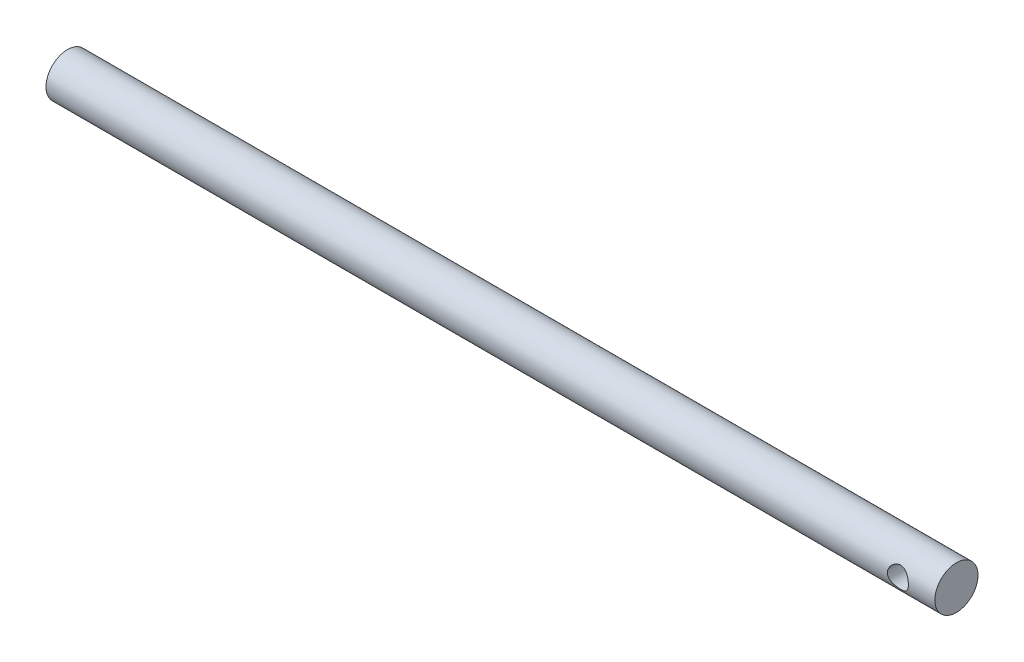
ISO-10303-21;
HEADER;
FILE_DESCRIPTION(('STEP AP214'),'2;1');
FILE_NAME('part.step','',(''),(''),'','','');
FILE_SCHEMA(('AUTOMOTIVE_DESIGN { 1 0 10303 214 1 1 1 1 }'));
ENDSEC;
DATA;
#1=APPLICATION_CONTEXT('core data for automotive mechanical design processes');
#2=APPLICATION_PROTOCOL_DEFINITION('international standard','automotive_design',2000,#1);
#3=PRODUCT_CONTEXT('',#1,'mechanical');
#4=PRODUCT('Part','Part','',(#3));
#5=PRODUCT_RELATED_PRODUCT_CATEGORY('part','',(#4));
#6=PRODUCT_DEFINITION_FORMATION('','',#4);
#7=PRODUCT_DEFINITION_CONTEXT('part definition',#1,'design');
#8=PRODUCT_DEFINITION('design','',#6,#7);
#9=PRODUCT_DEFINITION_SHAPE('','',#8);
#10=(LENGTH_UNIT() NAMED_UNIT(*) SI_UNIT(.MILLI.,.METRE.));
#11=(NAMED_UNIT(*) PLANE_ANGLE_UNIT() SI_UNIT($,.RADIAN.));
#12=(NAMED_UNIT(*) SI_UNIT($,.STERADIAN.) SOLID_ANGLE_UNIT());
#13=UNCERTAINTY_MEASURE_WITH_UNIT(LENGTH_MEASURE(1.E-05),#10,'distance_accuracy_value','');
#14=(GEOMETRIC_REPRESENTATION_CONTEXT(3) GLOBAL_UNCERTAINTY_ASSIGNED_CONTEXT((#13)) GLOBAL_UNIT_ASSIGNED_CONTEXT((#10,
#11,#12)) REPRESENTATION_CONTEXT('',''));
#15=CARTESIAN_POINT('',(0.,0.,0.));
#16=DIRECTION('',(0.,0.,1.));
#17=DIRECTION('',(1.,0.,0.));
#18=AXIS2_PLACEMENT_3D('',#15,#16,#17);
#19=CARTESIAN_POINT('',(70.7,80.6,0.));
#20=DIRECTION('',(1.,0.,0.));
#21=DIRECTION('',(0.,0.,1.));
#22=AXIS2_PLACEMENT_3D('',#19,#20,#21);
#23=PLANE('',#22);
#24=CARTESIAN_POINT('',(70.7,80.6,0.));
#25=DIRECTION('',(1.,0.,0.));
#26=DIRECTION('',(0.,0.,-1.));
#27=AXIS2_PLACEMENT_3D('',#24,#25,#26);
#28=CIRCLE('',#27,3.5);
#29=CARTESIAN_POINT('',(70.7,80.6,-3.5));
#30=VERTEX_POINT('',#29);
#31=EDGE_CURVE('E17',#30,#30,#28,.T.);
#32=ORIENTED_EDGE('',*,*,#31,.T.);
#33=EDGE_LOOP('',(#32));
#34=FACE_BOUND('',#33,.T.);
#35=ADVANCED_FACE('F14',(#34),#23,.T.);
#36=CARTESIAN_POINT('',(-73.5,80.6,0.));
#37=DIRECTION('',(1.,0.,0.));
#38=DIRECTION('',(0.,0.,1.));
#39=AXIS2_PLACEMENT_3D('',#36,#37,#38);
#40=PLANE('',#39);
#41=CARTESIAN_POINT('',(-73.5,80.6,0.));
#42=DIRECTION('',(1.,0.,0.));
#43=DIRECTION('',(0.,0.,-1.));
#44=AXIS2_PLACEMENT_3D('',#41,#42,#43);
#45=CIRCLE('',#44,3.5);
#46=CARTESIAN_POINT('',(-73.5,80.6,-3.5));
#47=VERTEX_POINT('',#46);
#48=EDGE_CURVE('E46',#47,#47,#45,.T.);
#49=ORIENTED_EDGE('',*,*,#48,.F.);
#50=EDGE_LOOP('',(#49));
#51=FACE_BOUND('',#50,.T.);
#52=ADVANCED_FACE('F108',(#51),#40,.F.);
#53=CARTESIAN_POINT('',(64.7,80.6,-4.));
#54=DIRECTION('',(0.,0.,1.));
#55=DIRECTION('',(1.,0.,0.));
#56=AXIS2_PLACEMENT_3D('',#53,#54,#55);
#57=CYLINDRICAL_SURFACE('',#56,1.7);
#58=DIRECTION('',(0.,0.,1.));
#59=VECTOR('',#58,1.);
#60=CARTESIAN_POINT('',(66.4,80.6,-4.));
#61=LINE('',#60,#59);
#62=CARTESIAN_POINT('',(66.4,80.6,-3.5));
#63=VERTEX_POINT('',#62);
#64=CARTESIAN_POINT('',(66.4,80.6,3.5));
#65=VERTEX_POINT('',#64);
#66=EDGE_CURVE('E9',#63,#65,#61,.T.);
#67=ORIENTED_EDGE('',*,*,#66,.F.);
#68=CARTESIAN_POINT('',(63.,80.6,-3.5));
#69=CARTESIAN_POINT('',(63.,80.467626961764,-3.5));
#70=CARTESIAN_POINT('',(63.012368936181,80.336082629433,-3.493992150921));
#71=CARTESIAN_POINT('',(63.036816250894,80.207410902409,-3.48211813001));
#72=CARTESIAN_POINT('',(63.072456959114,80.083599465136,-3.465056418101));
#73=CARTESIAN_POINT('',(63.117818095487,79.966454062094,-3.443988785715));
#74=CARTESIAN_POINT('',(63.194463223348,79.808603148655,-3.409720031189));
#75=CARTESIAN_POINT('',(63.219785481802,79.761219130431,-3.398555947052));
#76=CARTESIAN_POINT('',(63.246593857292,79.715335355493,-3.38692802402));
#77=CARTESIAN_POINT('',(63.274780549337,79.670972012776,-3.374927018793));
#78=CARTESIAN_POINT('',(63.304242631629,79.62814378284,-3.362641183717));
#79=CARTESIAN_POINT('',(63.372363089202,79.536357411385,-3.334883535461));
#80=CARTESIAN_POINT('',(63.411612428005,79.488157097466,-3.319309884091));
#81=CARTESIAN_POINT('',(63.452475038941,79.442246179138,-3.303581444565));
#82=CARTESIAN_POINT('',(63.494813540026,79.39860849316,-3.287835082887));
#83=CARTESIAN_POINT('',(63.538507672395,79.357225574193,-3.272198300415));
#84=CARTESIAN_POINT('',(63.636504589978,79.271870871535,-3.238601379104));
#85=CARTESIAN_POINT('',(63.691307533732,79.228770899575,-3.220728014406));
#86=CARTESIAN_POINT('',(63.747688318605,79.188752605912,-3.20336523669));
#87=CARTESIAN_POINT('',(63.805494278617,79.151794155935,-3.186694401143));
#88=CARTESIAN_POINT('',(63.864593317099,79.117878890136,-3.170881561662));
#89=CARTESIAN_POINT('',(63.982223412966,79.057615768401,-3.141991810153));
#90=CARTESIAN_POINT('',(64.040644926005,79.030979130598,-3.128818705613));
#91=CARTESIAN_POINT('',(64.100009380795,79.007095638706,-3.116695122328));
#92=CARTESIAN_POINT('',(64.160197185626,78.985972128808,-3.105743193823));
#93=CARTESIAN_POINT('',(64.221096760984,78.967615995983,-3.096067551833));
#94=CARTESIAN_POINT('',(64.350926799425,78.934732651396,-3.078517404664));
#95=CARTESIAN_POINT('',(64.419996089501,78.920855942297,-3.070961637835));
#96=CARTESIAN_POINT('',(64.489621521996,78.910432807268,-3.065209030803));
#97=CARTESIAN_POINT('',(64.559617395511,78.903478367105,-3.06134439336));
#98=CARTESIAN_POINT('',(64.629802528403,78.9,-3.059411708156));
#99=CARTESIAN_POINT('',(64.834561723354,78.9,-3.059411708156));
#100=CARTESIAN_POINT('',(64.968882545134,78.91278106465,-3.066513627042));
#101=CARTESIAN_POINT('',(65.101872224254,78.938259036702,-3.08067095027));
#102=CARTESIAN_POINT('',(65.232408619513,78.976373284679,-3.1013251367));
#103=CARTESIAN_POINT('',(65.359254226747,79.027050046866,-3.127411166813));
#104=CARTESIAN_POINT('',(65.542394180921,79.121774902055,-3.172710114264));
#105=CARTESIAN_POINT('',(65.602549456624,79.1566853597,-3.188934042963));
#106=CARTESIAN_POINT('',(65.661347794167,79.194763323085,-3.206036457297));
#107=CARTESIAN_POINT('',(65.71864827833,79.236027307423,-3.223840180764));
#108=CARTESIAN_POINT('',(65.774287287225,79.280501378077,-3.24215146178));
#109=CARTESIAN_POINT('',(65.872320231077,79.367456788735,-3.276066477418));
#110=CARTESIAN_POINT('',(65.915318135335,79.408896030022,-3.29157595415));
#111=CARTESIAN_POINT('',(65.956968060694,79.452549882023,-3.307172995556));
#112=CARTESIAN_POINT('',(65.997150986469,79.498435837086,-3.322732575525));
#113=CARTESIAN_POINT('',(66.035731332892,79.546568850322,-3.338120626365));
#114=CARTESIAN_POINT('',(66.102217709225,79.637548597836,-3.365335365513));
#115=CARTESIAN_POINT('',(66.130744053659,79.67960743773,-3.377274305976));
#116=CARTESIAN_POINT('',(66.158043023449,79.723126927967,-3.388930648383));
#117=CARTESIAN_POINT('',(66.184017943673,79.7680921572,-3.400221892537));
#118=CARTESIAN_POINT('',(66.208567928865,79.81448312499,-3.411063392848));
#119=CARTESIAN_POINT('',(66.283835178391,79.970745102033,-3.44475704851));
#120=CARTESIAN_POINT('',(66.328581336634,80.087221142821,-3.465553459099));
#121=CARTESIAN_POINT('',(66.363719503812,80.210236002231,-3.482378337048));
#122=CARTESIAN_POINT('',(66.387812989989,80.338014166915,-3.494080519134));
#123=CARTESIAN_POINT('',(66.4,80.468604065674,-3.5));
#124=CARTESIAN_POINT('',(66.4,80.6,-3.5));
#125=(BOUNDED_CURVE() B_SPLINE_CURVE(6,(#68,#69,#70,#71,#72,#73,#74,#75,#76,#77,#78,#79,#80,#81,
#82,#83,#84,#85,#86,#87,#88,#89,#90,#91,#92,#93,#94,#95,#96,#97,#98,#99,#100,#101,#102,#103,
#104,#105,#106,#107,#108,#109,#110,#111,#112,#113,#114,#115,#116,#117,#118,#119,#120,#121,#122,
#123,#124),.UNSPECIFIED.,.F.,.F.) B_SPLINE_CURVE_WITH_KNOTS((7,5,5,5,5,5,5,5,5,5,5,7),(0.,
0.126705234741,0.18350404575,0.252985723906,0.334996383348,0.413022152866,0.499693533218,
0.665834136864,0.749613049,0.818522163996,0.874025872331,1.),
.UNSPECIFIED.) CURVE() GEOMETRIC_REPRESENTATION_ITEM() RATIONAL_B_SPLINE_CURVE((1.,1.,1.,1.,1.,
1.,1.,1.,1.,1.,1.,1.,1.,1.,1.,1.,1.,1.,1.,1.,1.,1.,1.,1.,1.,1.,1.,1.,1.,1.,1.,1.,1.,1.,1.,1.,1.,
1.,1.,1.,1.,1.,1.,1.,1.,1.,1.,1.,1.,1.,1.,1.,1.,1.,1.,1.,1.)) REPRESENTATION_ITEM(''));
#126=CARTESIAN_POINT('',(63.,80.6,-3.5));
#127=VERTEX_POINT('',#126);
#128=EDGE_CURVE('E76',#127,#63,#125,.T.);
#129=ORIENTED_EDGE('',*,*,#128,.F.);
#130=CARTESIAN_POINT('',(66.4,80.6,-3.5));
#131=CARTESIAN_POINT('',(66.4,80.732373038236,-3.5));
#132=CARTESIAN_POINT('',(66.387631063819,80.863917370567,-3.493992150921));
#133=CARTESIAN_POINT('',(66.363183749106,80.992589097591,-3.48211813001));
#134=CARTESIAN_POINT('',(66.327543040886,81.116400534864,-3.465056418101));
#135=CARTESIAN_POINT('',(66.282181904513,81.233545937906,-3.443988785715));
#136=CARTESIAN_POINT('',(66.205536776652,81.391396851345,-3.409720031189));
#137=CARTESIAN_POINT('',(66.180214518198,81.438780869569,-3.398555947052));
#138=CARTESIAN_POINT('',(66.153406142708,81.484664644507,-3.38692802402));
#139=CARTESIAN_POINT('',(66.125219450663,81.529027987224,-3.374927018793));
#140=CARTESIAN_POINT('',(66.095757368371,81.57185621716,-3.362641183717));
#141=CARTESIAN_POINT('',(66.027636910798,81.663642588615,-3.334883535461));
#142=CARTESIAN_POINT('',(65.988387571995,81.711842902534,-3.319309884091));
#143=CARTESIAN_POINT('',(65.947524961059,81.757753820862,-3.303581444565));
#144=CARTESIAN_POINT('',(65.905186459974,81.80139150684,-3.287835082887));
#145=CARTESIAN_POINT('',(65.861492327605,81.842774425807,-3.272198300415));
#146=CARTESIAN_POINT('',(65.763495410022,81.928129128465,-3.238601379104));
#147=CARTESIAN_POINT('',(65.708692466268,81.971229100425,-3.220728014406));
#148=CARTESIAN_POINT('',(65.652311681395,82.011247394088,-3.20336523669));
#149=CARTESIAN_POINT('',(65.594505721383,82.048205844065,-3.186694401143));
#150=CARTESIAN_POINT('',(65.535406682901,82.082121109864,-3.170881561662));
#151=CARTESIAN_POINT('',(65.417776587034,82.142384231599,-3.141991810153));
#152=CARTESIAN_POINT('',(65.359355073996,82.169020869402,-3.128818705613));
#153=CARTESIAN_POINT('',(65.299990619205,82.192904361294,-3.116695122328));
#154=CARTESIAN_POINT('',(65.239802814374,82.214027871192,-3.105743193823));
#155=CARTESIAN_POINT('',(65.178903239016,82.232384004017,-3.096067551833));
#156=CARTESIAN_POINT('',(65.049073200575,82.265267348604,-3.078517404664));
#157=CARTESIAN_POINT('',(64.980003910499,82.279144057703,-3.070961637835));
#158=CARTESIAN_POINT('',(64.910378478004,82.289567192732,-3.065209030803));
#159=CARTESIAN_POINT('',(64.840382604489,82.296521632895,-3.06134439336));
#160=CARTESIAN_POINT('',(64.770197471597,82.3,-3.059411708156));
#161=CARTESIAN_POINT('',(64.565438276646,82.3,-3.059411708156));
#162=CARTESIAN_POINT('',(64.431117454866,82.28721893535,-3.066513627042));
#163=CARTESIAN_POINT('',(64.298127775745,82.261740963298,-3.08067095027));
#164=CARTESIAN_POINT('',(64.167591380487,82.223626715321,-3.1013251367));
#165=CARTESIAN_POINT('',(64.040745773253,82.172949953134,-3.127411166813));
#166=CARTESIAN_POINT('',(63.857605819079,82.078225097945,-3.172710114264));
#167=CARTESIAN_POINT('',(63.797450543376,82.0433146403,-3.188934042963));
#168=CARTESIAN_POINT('',(63.738652205833,82.005236676915,-3.206036457297));
#169=CARTESIAN_POINT('',(63.68135172167,81.963972692577,-3.223840180764));
#170=CARTESIAN_POINT('',(63.625712712775,81.919498621923,-3.24215146178));
#171=CARTESIAN_POINT('',(63.527679768923,81.832543211265,-3.276066477418));
#172=CARTESIAN_POINT('',(63.484681864665,81.791103969978,-3.29157595415));
#173=CARTESIAN_POINT('',(63.443031939305,81.747450117977,-3.307172995556));
#174=CARTESIAN_POINT('',(63.402849013531,81.701564162914,-3.322732575525));
#175=CARTESIAN_POINT('',(63.364268667108,81.653431149678,-3.338120626365));
#176=CARTESIAN_POINT('',(63.297782284494,81.562451393568,-3.365335368085));
#177=CARTESIAN_POINT('',(63.269255947502,81.520392565785,-3.377274305394));
#178=CARTESIAN_POINT('',(63.241956982364,81.47687308176,-3.388930645903));
#179=CARTESIAN_POINT('',(63.215982058298,81.431907844441,-3.400221891784));
#180=CARTESIAN_POINT('',(63.191432065867,81.385516864073,-3.411063395206));
#181=CARTESIAN_POINT('',(63.116164821609,81.229254897967,-3.44475704851));
#182=CARTESIAN_POINT('',(63.071418663367,81.112778857179,-3.465553459099));
#183=CARTESIAN_POINT('',(63.036280496188,80.989763997769,-3.482378337048));
#184=CARTESIAN_POINT('',(63.012187010011,80.861985833085,-3.494080519134));
#185=CARTESIAN_POINT('',(63.,80.731395934326,-3.5));
#186=CARTESIAN_POINT('',(63.,80.6,-3.5));
#187=(BOUNDED_CURVE() B_SPLINE_CURVE(6,(#130,#131,#132,#133,#134,#135,#136,#137,#138,#139,#140,
#141,#142,#143,#144,#145,#146,#147,#148,#149,#150,#151,#152,#153,#154,#155,#156,#157,#158,#159,
#160,#161,#162,#163,#164,#165,#166,#167,#168,#169,#170,#171,#172,#173,#174,#175,#176,#177,#178,
#179,#180,#181,#182,#183,#184,#185,#186),.UNSPECIFIED.,.F.,.F.) B_SPLINE_CURVE_WITH_KNOTS((7,5,
5,5,5,5,5,5,5,5,5,7),(0.,0.126705226218,0.183504033407,0.25298570689,0.334996360815,
0.413022125086,0.499693499608,0.66583409208,0.749612998581,0.818522108943,0.874025825298,1.),
.UNSPECIFIED.) CURVE() GEOMETRIC_REPRESENTATION_ITEM() RATIONAL_B_SPLINE_CURVE((1.,1.,1.,1.,1.,
1.,1.,1.,1.,1.,1.,1.,1.,1.,1.,1.,1.,1.,1.,1.,1.,1.,1.,1.,1.,1.,1.,1.,1.,1.,1.,1.,1.,1.,1.,1.,1.,
1.,1.,1.,1.,1.,1.,1.,1.,1.,1.,1.,1.,1.,1.,1.,1.,1.,1.,1.,1.)) REPRESENTATION_ITEM(''));
#188=EDGE_CURVE('E60',#63,#127,#187,.T.);
#189=ORIENTED_EDGE('',*,*,#188,.F.);
#190=ORIENTED_EDGE('',*,*,#66,.T.);
#191=CARTESIAN_POINT('',(66.4,80.6,3.5));
#192=CARTESIAN_POINT('',(66.4,80.732373038236,3.5));
#193=CARTESIAN_POINT('',(66.387631063819,80.863917370568,3.493992150921));
#194=CARTESIAN_POINT('',(66.363183749106,80.992589097591,3.48211813001));
#195=CARTESIAN_POINT('',(66.327543040886,81.116400534864,3.465056418101));
#196=CARTESIAN_POINT('',(66.282181904513,81.233545937906,3.443988785715));
#197=CARTESIAN_POINT('',(66.205536776652,81.391396851345,3.409720031189));
#198=CARTESIAN_POINT('',(66.180214518198,81.438780869569,3.398555947052));
#199=CARTESIAN_POINT('',(66.153406142708,81.484664644507,3.38692802402));
#200=CARTESIAN_POINT('',(66.125219450663,81.529027987224,3.374927018793));
#201=CARTESIAN_POINT('',(66.095757368371,81.57185621716,3.362641183717));
#202=CARTESIAN_POINT('',(66.027636910798,81.663642588615,3.334883535461));
#203=CARTESIAN_POINT('',(65.988387571995,81.711842902534,3.319309884091));
#204=CARTESIAN_POINT('',(65.947524961059,81.757753820862,3.303581444565));
#205=CARTESIAN_POINT('',(65.905186459974,81.80139150684,3.287835082887));
#206=CARTESIAN_POINT('',(65.861492327605,81.842774425807,3.272198300415));
#207=CARTESIAN_POINT('',(65.763495410022,81.928129128465,3.238601379104));
#208=CARTESIAN_POINT('',(65.708692466268,81.971229100425,3.220728014406));
#209=CARTESIAN_POINT('',(65.652311681395,82.011247394088,3.20336523669));
#210=CARTESIAN_POINT('',(65.594505721383,82.048205844065,3.186694401143));
#211=CARTESIAN_POINT('',(65.535406682901,82.082121109864,3.170881561662));
#212=CARTESIAN_POINT('',(65.417776587034,82.142384231599,3.141991810153));
#213=CARTESIAN_POINT('',(65.359355073995,82.169020869402,3.128818705613));
#214=CARTESIAN_POINT('',(65.299990619205,82.192904361294,3.116695122329));
#215=CARTESIAN_POINT('',(65.239802814374,82.214027871192,3.105743193824));
#216=CARTESIAN_POINT('',(65.178903239016,82.232384004017,3.096067551833));
#217=CARTESIAN_POINT('',(65.049073200575,82.265267348604,3.078517404664));
#218=CARTESIAN_POINT('',(64.980003910499,82.279144057703,3.070961637835));
#219=CARTESIAN_POINT('',(64.910378478004,82.289567192732,3.065209030803));
#220=CARTESIAN_POINT('',(64.840382604489,82.296521632895,3.06134439336));
#221=CARTESIAN_POINT('',(64.770197471597,82.3,3.059411708156));
#222=CARTESIAN_POINT('',(64.565438276646,82.3,3.059411708156));
#223=CARTESIAN_POINT('',(64.431117454866,82.28721893535,3.066513627042));
#224=CARTESIAN_POINT('',(64.298127775746,82.261740963298,3.08067095027));
#225=CARTESIAN_POINT('',(64.167591380487,82.223626715321,3.1013251367));
#226=CARTESIAN_POINT('',(64.040745773253,82.172949953134,3.127411166813));
#227=CARTESIAN_POINT('',(63.857605819079,82.078225097945,3.172710114264));
#228=CARTESIAN_POINT('',(63.797450543376,82.0433146403,3.188934042963));
#229=CARTESIAN_POINT('',(63.738652205833,82.005236676915,3.206036457297));
#230=CARTESIAN_POINT('',(63.68135172167,81.963972692577,3.223840180764));
#231=CARTESIAN_POINT('',(63.625712712775,81.919498621923,3.24215146178));
#232=CARTESIAN_POINT('',(63.527679765886,81.832543208571,3.276066478469));
#233=CARTESIAN_POINT('',(63.484681865759,81.791103970458,3.291575953834));
#234=CARTESIAN_POINT('',(63.443031942155,81.747450121134,3.307172994485));
#235=CARTESIAN_POINT('',(63.402849013957,81.70156416411,3.322732575269));
#236=CARTESIAN_POINT('',(63.364268664446,81.653431146037,3.338120627454));
#237=CARTESIAN_POINT('',(63.297782284494,81.562451393568,3.365335368085));
#238=CARTESIAN_POINT('',(63.269255947502,81.520392565785,3.377274305394));
#239=CARTESIAN_POINT('',(63.241956982364,81.47687308176,3.388930645903));
#240=CARTESIAN_POINT('',(63.215982058298,81.431907844441,3.400221891784));
#241=CARTESIAN_POINT('',(63.191432065867,81.385516864073,3.411063395206));
#242=CARTESIAN_POINT('',(63.138164233229,81.274927771296,3.434908932569));
#243=CARTESIAN_POINT('',(63.110528040144,81.209649356495,3.447537049086));
#244=CARTESIAN_POINT('',(63.085825612466,81.142091046458,3.459020484849));
#245=CARTESIAN_POINT('',(63.064339203336,81.072479370317,3.469143717989));
#246=CARTESIAN_POINT('',(63.0463147191,81.00106404391,3.477717107832));
#247=CARTESIAN_POINT('',(63.010433319595,80.818654514117,3.494893157432));
#248=CARTESIAN_POINT('',(62.997191296132,80.705820566747,3.501355052023));
#249=CARTESIAN_POINT('',(62.993084534697,80.591296032958,3.50338771628));
#250=CARTESIAN_POINT('',(62.998366939204,80.476860549106,3.500778524825));
#251=CARTESIAN_POINT('',(63.0127423091,80.364291044026,3.493772340176));
#252=CARTESIAN_POINT('',(63.049989099161,80.184433097865,3.475970364206));
#253=CARTESIAN_POINT('',(63.068116295068,80.115111937202,3.467363789869));
#254=CARTESIAN_POINT('',(63.089500765281,80.047541041852,3.457308465121));
#255=CARTESIAN_POINT('',(63.11391249979,79.981944255144,3.44598184347));
#256=CARTESIAN_POINT('',(63.141090500133,79.918524461951,3.433583475628));
#257=CARTESIAN_POINT('',(63.194463228818,79.808603137388,3.409720028743));
#258=CARTESIAN_POINT('',(63.219785479769,79.761219132061,3.398555947821));
#259=CARTESIAN_POINT('',(63.246593851267,79.715335365452,3.386928026582));
#260=CARTESIAN_POINT('',(63.274780548124,79.670972016417,3.374927019402));
#261=CARTESIAN_POINT('',(63.304242638125,79.628143774088,3.36264118107));
#262=CARTESIAN_POINT('',(63.372363089202,79.536357411385,3.334883535461));
#263=CARTESIAN_POINT('',(63.411612428005,79.488157097466,3.319309884091));
#264=CARTESIAN_POINT('',(63.452475038941,79.442246179138,3.303581444565));
#265=CARTESIAN_POINT('',(63.494813540026,79.39860849316,3.287835082887));
#266=CARTESIAN_POINT('',(63.538507672395,79.357225574193,3.272198300415));
#267=CARTESIAN_POINT('',(63.636504589978,79.271870871535,3.238601379104));
#268=CARTESIAN_POINT('',(63.691307533732,79.228770899575,3.220728014406));
#269=CARTESIAN_POINT('',(63.747688318605,79.188752605912,3.20336523669));
#270=CARTESIAN_POINT('',(63.805494278617,79.151794155935,3.186694401143));
#271=CARTESIAN_POINT('',(63.864593317099,79.117878890136,3.170881561662));
#272=CARTESIAN_POINT('',(63.982223412966,79.057615768401,3.141991810153));
#273=CARTESIAN_POINT('',(64.040644926004,79.030979130598,3.128818705613));
#274=CARTESIAN_POINT('',(64.100009380795,79.007095638706,3.116695122328));
#275=CARTESIAN_POINT('',(64.160197185626,78.985972128808,3.105743193823));
#276=CARTESIAN_POINT('',(64.221096760984,78.967615995983,3.096067551833));
#277=CARTESIAN_POINT('',(64.350926799425,78.934732651396,3.078517404664));
#278=CARTESIAN_POINT('',(64.419996089501,78.920855942297,3.070961637835));
#279=CARTESIAN_POINT('',(64.489621521996,78.910432807268,3.065209030803));
#280=CARTESIAN_POINT('',(64.559617395511,78.903478367105,3.06134439336));
#281=CARTESIAN_POINT('',(64.629802528403,78.9,3.059411708156));
#282=CARTESIAN_POINT('',(64.834561723354,78.9,3.059411708156));
#283=CARTESIAN_POINT('',(64.968882545134,78.91278106465,3.066513627042));
#284=CARTESIAN_POINT('',(65.101872224254,78.938259036702,3.08067095027));
#285=CARTESIAN_POINT('',(65.232408619513,78.976373284679,3.1013251367));
#286=CARTESIAN_POINT('',(65.359254226747,79.027050046866,3.127411166813));
#287=CARTESIAN_POINT('',(65.542394180921,79.121774902055,3.172710114264));
#288=CARTESIAN_POINT('',(65.602549456624,79.1566853597,3.188934042963));
#289=CARTESIAN_POINT('',(65.661347794167,79.194763323085,3.206036457297));
#290=CARTESIAN_POINT('',(65.71864827833,79.236027307423,3.223840180764));
#291=CARTESIAN_POINT('',(65.774287287225,79.280501378077,3.24215146178));
#292=CARTESIAN_POINT('',(65.872320231077,79.367456788735,3.276066477418));
#293=CARTESIAN_POINT('',(65.915318135335,79.408896030022,3.29157595415));
#294=CARTESIAN_POINT('',(65.956968060695,79.452549882023,3.307172995556));
#295=CARTESIAN_POINT('',(65.997150986469,79.498435837086,3.322732575525));
#296=CARTESIAN_POINT('',(66.035731332892,79.546568850322,3.338120626365));
#297=CARTESIAN_POINT('',(66.102217715506,79.637548606432,3.365335368085));
#298=CARTESIAN_POINT('',(66.130744052498,79.679607434215,3.377274305394));
#299=CARTESIAN_POINT('',(66.158043017636,79.72312691824,3.388930645903));
#300=CARTESIAN_POINT('',(66.184017941702,79.768092155558,3.400221891784));
#301=CARTESIAN_POINT('',(66.208567934133,79.814483135927,3.411063395206));
#302=CARTESIAN_POINT('',(66.283835178391,79.970745102033,3.44475704851));
#303=CARTESIAN_POINT('',(66.328581336634,80.087221142821,3.465553459099));
#304=CARTESIAN_POINT('',(66.363719503812,80.210236002231,3.482378337048));
#305=CARTESIAN_POINT('',(66.387812989989,80.338014166915,3.494080519134));
#306=CARTESIAN_POINT('',(66.4,80.468604065674,3.5));
#307=CARTESIAN_POINT('',(66.4,80.6,3.5));
#308=(BOUNDED_CURVE() B_SPLINE_CURVE(6,(#191,#192,#193,#194,#195,#196,#197,#198,#199,#200,#201,
#202,#203,#204,#205,#206,#207,#208,#209,#210,#211,#212,#213,#214,#215,#216,#217,#218,#219,#220,
#221,#222,#223,#224,#225,#226,#227,#228,#229,#230,#231,#232,#233,#234,#235,#236,#237,#238,#239,
#240,#241,#242,#243,#244,#245,#246,#247,#248,#249,#250,#251,#252,#253,#254,#255,#256,#257,#258,
#259,#260,#261,#262,#263,#264,#265,#266,#267,#268,#269,#270,#271,#272,#273,#274,#275,#276,#277,
#278,#279,#280,#281,#282,#283,#284,#285,#286,#287,#288,#289,#290,#291,#292,#293,#294,#295,#296,
#297,#298,#299,#300,#301,#302,#303,#304,#305,#306,#307),.UNSPECIFIED.,.T.,
.F.) B_SPLINE_CURVE_WITH_KNOTS((7,5,5,5,5,5,5,5,5,5,5,5,5,5,5,5,5,5,5,5,5,5,5,7),(0.,
0.06328678637236,0.09165668147463,0.126361420638,0.167324140883,0.206296486557,0.249587145733,
0.33257112751,0.374417055389,0.408835812815,0.436558839242,0.472986499648,0.527647250673,
0.56315636443,0.591568526343,0.626324977635,0.667348734774,0.706379151565,0.749734316401,
0.832841949254,0.874750230058,0.909220271118,0.936984602593,1.),
.UNSPECIFIED.) CURVE() GEOMETRIC_REPRESENTATION_ITEM() RATIONAL_B_SPLINE_CURVE((1.,1.,1.,1.,1.,
1.,1.,1.,1.,1.,1.,1.,1.,1.,1.,1.,1.,1.,1.,1.,1.,1.,1.,1.,1.,1.,1.,1.,1.,1.,1.,1.,1.,1.,1.,1.,1.,
1.,1.,1.,1.,1.,1.,1.,1.,1.,1.,1.,1.,1.,1.,1.,1.,1.,1.,1.,1.,1.,1.,1.,1.,1.,1.,1.,1.,1.,1.,1.,1.,
1.,1.,1.,1.,1.,1.,1.,1.,1.,1.,1.,1.,1.,1.,1.,1.,1.,1.,1.,1.,1.,1.,1.,1.,1.,1.,1.,1.,1.,1.,1.,1.,
1.,1.,1.,1.,1.,1.,1.,1.,1.,1.,1.,1.,1.,1.,1.,1.)) REPRESENTATION_ITEM(''));
#309=EDGE_CURVE('E23',#65,#65,#308,.T.);
#310=ORIENTED_EDGE('',*,*,#309,.T.);
#311=EDGE_LOOP('',(#67,#129,#189,#190,#310));
#312=FACE_BOUND('',#311,.T.);
#313=ADVANCED_FACE('F100',(#312),#57,.F.);
#314=CARTESIAN_POINT('',(-73.5,80.6,0.));
#315=DIRECTION('',(1.,0.,0.));
#316=DIRECTION('',(0.,0.,-1.));
#317=AXIS2_PLACEMENT_3D('',#314,#315,#316);
#318=CYLINDRICAL_SURFACE('',#317,3.5);
#319=ORIENTED_EDGE('',*,*,#309,.F.);
#320=EDGE_LOOP('',(#319));
#321=FACE_BOUND('',#320,.T.);
#322=DIRECTION('',(1.,0.,0.));
#323=VECTOR('',#322,1.);
#324=CARTESIAN_POINT('',(-73.5,80.6,-3.5));
#325=LINE('',#324,#323);
#326=EDGE_CURVE('E61',#63,#30,#325,.T.);
#327=ORIENTED_EDGE('',*,*,#326,.T.);
#328=ORIENTED_EDGE('',*,*,#31,.F.);
#329=ORIENTED_EDGE('',*,*,#326,.F.);
#330=ORIENTED_EDGE('',*,*,#188,.T.);
#331=DIRECTION('',(1.,0.,0.));
#332=VECTOR('',#331,1.);
#333=CARTESIAN_POINT('',(-73.5,80.6,-3.5));
#334=LINE('',#333,#332);
#335=EDGE_CURVE('E67',#47,#127,#334,.T.);
#336=ORIENTED_EDGE('',*,*,#335,.F.);
#337=ORIENTED_EDGE('',*,*,#48,.T.);
#338=ORIENTED_EDGE('',*,*,#335,.T.);
#339=ORIENTED_EDGE('',*,*,#128,.T.);
#340=EDGE_LOOP('',(#327,#328,#329,#330,#336,#337,#338,#339));
#341=FACE_BOUND('',#340,.T.);
#342=ADVANCED_FACE('F102',(#321,#341),#318,.T.);
#343=CLOSED_SHELL('',(#35,#52,#313,#342));
#344=MANIFOLD_SOLID_BREP('B1',#343);
#345=ADVANCED_BREP_SHAPE_REPRESENTATION('',(#18,#344),#14);
#346=SHAPE_DEFINITION_REPRESENTATION(#9,#345);
ENDSEC;
END-ISO-10303-21;
